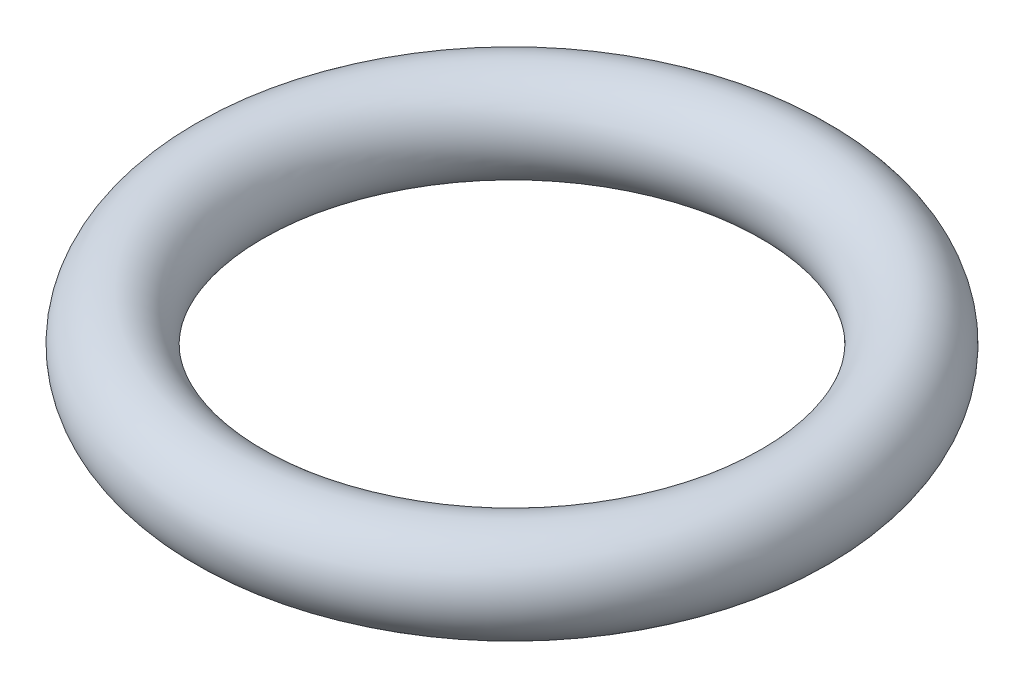
ISO-10303-21;
HEADER;
FILE_DESCRIPTION(('STEP AP214'),'2;1');
FILE_NAME('part.step','',(''),(''),'','','');
FILE_SCHEMA(('AUTOMOTIVE_DESIGN { 1 0 10303 214 1 1 1 1 }'));
ENDSEC;
DATA;
#1=APPLICATION_CONTEXT('core data for automotive mechanical design processes');
#2=APPLICATION_PROTOCOL_DEFINITION('international standard','automotive_design',2000,#1);
#3=PRODUCT_CONTEXT('',#1,'mechanical');
#4=PRODUCT('Part','Part','',(#3));
#5=PRODUCT_RELATED_PRODUCT_CATEGORY('part','',(#4));
#6=PRODUCT_DEFINITION_FORMATION('','',#4);
#7=PRODUCT_DEFINITION_CONTEXT('part definition',#1,'design');
#8=PRODUCT_DEFINITION('design','',#6,#7);
#9=PRODUCT_DEFINITION_SHAPE('','',#8);
#10=(LENGTH_UNIT() NAMED_UNIT(*) SI_UNIT(.MILLI.,.METRE.));
#11=(NAMED_UNIT(*) PLANE_ANGLE_UNIT() SI_UNIT($,.RADIAN.));
#12=(NAMED_UNIT(*) SI_UNIT($,.STERADIAN.) SOLID_ANGLE_UNIT());
#13=UNCERTAINTY_MEASURE_WITH_UNIT(LENGTH_MEASURE(1.E-05),#10,'distance_accuracy_value','');
#14=(GEOMETRIC_REPRESENTATION_CONTEXT(3) GLOBAL_UNCERTAINTY_ASSIGNED_CONTEXT((#13)) GLOBAL_UNIT_ASSIGNED_CONTEXT((#10,
#11,#12)) REPRESENTATION_CONTEXT('',''));
#15=CARTESIAN_POINT('',(0.,0.,0.));
#16=DIRECTION('',(0.,0.,1.));
#17=DIRECTION('',(1.,0.,0.));
#18=AXIS2_PLACEMENT_3D('',#15,#16,#17);
#19=CARTESIAN_POINT('',(0.,0.,0.));
#20=DIRECTION('',(0.,-1.,0.));
#21=DIRECTION('',(1.,0.,0.));
#22=AXIS2_PLACEMENT_3D('',#19,#20,#21);
#23=TOROIDAL_SURFACE('',#22,6.,1.);
#24=CARTESIAN_POINT('',(7.,0.,0.));
#25=VERTEX_POINT('',#24);
#26=VERTEX_LOOP('',#25);
#27=FACE_BOUND('',#26,.T.);
#28=ADVANCED_FACE('F31',(#27),#23,.T.);
#29=CLOSED_SHELL('',(#28));
#30=MANIFOLD_SOLID_BREP('B2',#29);
#31=ADVANCED_BREP_SHAPE_REPRESENTATION('',(#18,#30),#14);
#32=SHAPE_DEFINITION_REPRESENTATION(#9,#31);
ENDSEC;
END-ISO-10303-21;
